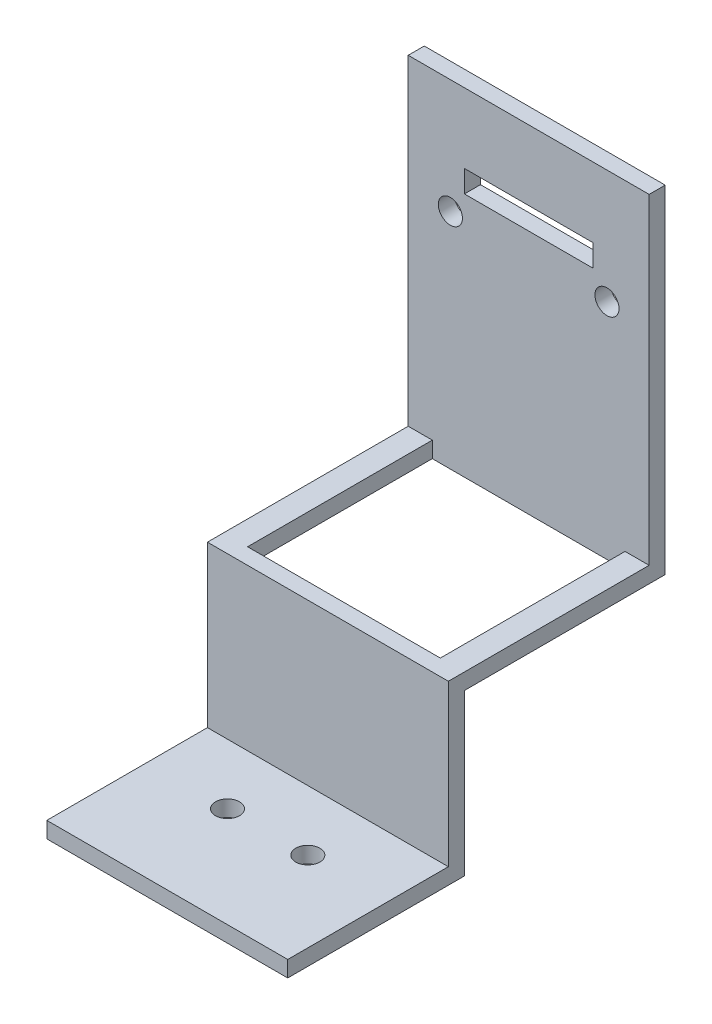
ISO-10303-21;
HEADER;
FILE_DESCRIPTION(('STEP AP214'),'2;1');
FILE_NAME('part.step','',(''),(''),'','','');
FILE_SCHEMA(('AUTOMOTIVE_DESIGN { 1 0 10303 214 1 1 1 1 }'));
ENDSEC;
DATA;
#1=APPLICATION_CONTEXT('core data for automotive mechanical design processes');
#2=APPLICATION_PROTOCOL_DEFINITION('international standard','automotive_design',2000,#1);
#3=PRODUCT_CONTEXT('',#1,'mechanical');
#4=PRODUCT('Part','Part','',(#3));
#5=PRODUCT_RELATED_PRODUCT_CATEGORY('part','',(#4));
#6=PRODUCT_DEFINITION_FORMATION('','',#4);
#7=PRODUCT_DEFINITION_CONTEXT('part definition',#1,'design');
#8=PRODUCT_DEFINITION('design','',#6,#7);
#9=PRODUCT_DEFINITION_SHAPE('','',#8);
#10=(LENGTH_UNIT() NAMED_UNIT(*) SI_UNIT(.MILLI.,.METRE.));
#11=(NAMED_UNIT(*) PLANE_ANGLE_UNIT() SI_UNIT($,.RADIAN.));
#12=(NAMED_UNIT(*) SI_UNIT($,.STERADIAN.) SOLID_ANGLE_UNIT());
#13=UNCERTAINTY_MEASURE_WITH_UNIT(LENGTH_MEASURE(1.E-05),#10,'distance_accuracy_value','');
#14=(GEOMETRIC_REPRESENTATION_CONTEXT(3) GLOBAL_UNCERTAINTY_ASSIGNED_CONTEXT((#13)) GLOBAL_UNIT_ASSIGNED_CONTEXT((#10,
#11,#12)) REPRESENTATION_CONTEXT('',''));
#15=CARTESIAN_POINT('',(0.,0.,0.));
#16=DIRECTION('',(0.,0.,1.));
#17=DIRECTION('',(1.,0.,0.));
#18=AXIS2_PLACEMENT_3D('',#15,#16,#17);
#19=CARTESIAN_POINT('',(0.,0.,2.));
#20=DIRECTION('',(1.,0.,0.));
#21=DIRECTION('',(0.,0.,-1.));
#22=AXIS2_PLACEMENT_3D('',#19,#20,#21);
#23=PLANE('',#22);
#24=DIRECTION('',(0.,-1.,0.));
#25=VECTOR('',#24,1.);
#26=CARTESIAN_POINT('',(0.,0.,0.));
#27=LINE('',#26,#25);
#28=CARTESIAN_POINT('',(0.,40.,0.));
#29=VERTEX_POINT('',#28);
#30=CARTESIAN_POINT('',(0.,-2.,0.));
#31=VERTEX_POINT('',#30);
#32=EDGE_CURVE('E289',#29,#31,#27,.T.);
#33=ORIENTED_EDGE('',*,*,#32,.T.);
#34=DIRECTION('',(0.,0.,-1.));
#35=VECTOR('',#34,1.);
#36=CARTESIAN_POINT('',(0.,-2.,0.));
#37=LINE('',#36,#35);
#38=CARTESIAN_POINT('',(0.,-2.,25.));
#39=VERTEX_POINT('',#38);
#40=EDGE_CURVE('E264',#39,#31,#37,.T.);
#41=ORIENTED_EDGE('',*,*,#40,.F.);
#42=DIRECTION('',(0.,1.,0.));
#43=VECTOR('',#42,1.);
#44=CARTESIAN_POINT('',(0.,-2.,25.));
#45=LINE('',#44,#43);
#46=CARTESIAN_POINT('',(0.,-22.,25.));
#47=VERTEX_POINT('',#46);
#48=EDGE_CURVE('E261',#47,#39,#45,.T.);
#49=ORIENTED_EDGE('',*,*,#48,.F.);
#50=DIRECTION('',(0.,0.,-1.));
#51=VECTOR('',#50,1.);
#52=CARTESIAN_POINT('',(0.,-22.,25.));
#53=LINE('',#52,#51);
#54=CARTESIAN_POINT('',(0.,-22.,47.));
#55=VERTEX_POINT('',#54);
#56=EDGE_CURVE('E259',#55,#47,#53,.T.);
#57=ORIENTED_EDGE('',*,*,#56,.F.);
#58=DIRECTION('',(0.,-1.,0.));
#59=VECTOR('',#58,1.);
#60=CARTESIAN_POINT('',(0.,-20.,47.));
#61=LINE('',#60,#59);
#62=CARTESIAN_POINT('',(0.,-20.,47.));
#63=VERTEX_POINT('',#62);
#64=EDGE_CURVE('E256',#63,#55,#61,.T.);
#65=ORIENTED_EDGE('',*,*,#64,.F.);
#66=DIRECTION('',(0.,0.,1.));
#67=VECTOR('',#66,1.);
#68=CARTESIAN_POINT('',(0.,-20.,27.));
#69=LINE('',#68,#67);
#70=CARTESIAN_POINT('',(0.,-20.,27.));
#71=VERTEX_POINT('',#70);
#72=EDGE_CURVE('E254',#71,#63,#69,.T.);
#73=ORIENTED_EDGE('',*,*,#72,.F.);
#74=DIRECTION('',(0.,-1.,0.));
#75=VECTOR('',#74,1.);
#76=CARTESIAN_POINT('',(0.,-20.,27.));
#77=LINE('',#76,#75);
#78=CARTESIAN_POINT('',(0.,0.,27.));
#79=VERTEX_POINT('',#78);
#80=EDGE_CURVE('E229',#79,#71,#77,.T.);
#81=ORIENTED_EDGE('',*,*,#80,.F.);
#82=DIRECTION('',(0.,0.,1.));
#83=VECTOR('',#82,1.);
#84=CARTESIAN_POINT('',(0.,0.,0.));
#85=LINE('',#84,#83);
#86=CARTESIAN_POINT('',(0.,0.,2.));
#87=VERTEX_POINT('',#86);
#88=EDGE_CURVE('E239',#87,#79,#85,.T.);
#89=ORIENTED_EDGE('',*,*,#88,.F.);
#90=DIRECTION('',(0.,-1.,0.));
#91=VECTOR('',#90,1.);
#92=CARTESIAN_POINT('',(0.,0.,2.));
#93=LINE('',#92,#91);
#94=CARTESIAN_POINT('',(0.,40.,2.));
#95=VERTEX_POINT('',#94);
#96=EDGE_CURVE('E290',#95,#87,#93,.T.);
#97=ORIENTED_EDGE('',*,*,#96,.F.);
#98=DIRECTION('',(0.,0.,-1.));
#99=VECTOR('',#98,1.);
#100=CARTESIAN_POINT('',(0.,40.,2.));
#101=LINE('',#100,#99);
#102=EDGE_CURVE('E42',#95,#29,#101,.T.);
#103=ORIENTED_EDGE('',*,*,#102,.T.);
#104=EDGE_LOOP('',(#33,#41,#49,#57,#65,#73,#81,#89,#97,#103));
#105=FACE_BOUND('',#104,.T.);
#106=ADVANCED_FACE('F35',(#105),#23,.F.);
#107=CARTESIAN_POINT('',(30.,0.,2.));
#108=DIRECTION('',(-1.,0.,0.));
#109=DIRECTION('',(0.,0.,1.));
#110=AXIS2_PLACEMENT_3D('',#107,#108,#109);
#111=PLANE('',#110);
#112=DIRECTION('',(0.,1.,0.));
#113=VECTOR('',#112,1.);
#114=CARTESIAN_POINT('',(30.,0.,0.));
#115=LINE('',#114,#113);
#116=CARTESIAN_POINT('',(30.,-2.,0.));
#117=VERTEX_POINT('',#116);
#118=CARTESIAN_POINT('',(30.,40.,0.));
#119=VERTEX_POINT('',#118);
#120=EDGE_CURVE('E303',#117,#119,#115,.T.);
#121=ORIENTED_EDGE('',*,*,#120,.T.);
#122=DIRECTION('',(0.,0.,-1.));
#123=VECTOR('',#122,1.);
#124=CARTESIAN_POINT('',(30.,40.,2.));
#125=LINE('',#124,#123);
#126=CARTESIAN_POINT('',(30.,40.,2.));
#127=VERTEX_POINT('',#126);
#128=EDGE_CURVE('E11',#127,#119,#125,.T.);
#129=ORIENTED_EDGE('',*,*,#128,.F.);
#130=DIRECTION('',(0.,1.,0.));
#131=VECTOR('',#130,1.);
#132=CARTESIAN_POINT('',(30.,0.,2.));
#133=LINE('',#132,#131);
#134=CARTESIAN_POINT('',(30.,0.,2.));
#135=VERTEX_POINT('',#134);
#136=EDGE_CURVE('E298',#135,#127,#133,.T.);
#137=ORIENTED_EDGE('',*,*,#136,.F.);
#138=DIRECTION('',(0.,0.,1.));
#139=VECTOR('',#138,1.);
#140=CARTESIAN_POINT('',(30.,0.,27.));
#141=LINE('',#140,#139);
#142=CARTESIAN_POINT('',(30.,0.,27.));
#143=VERTEX_POINT('',#142);
#144=EDGE_CURVE('E236',#135,#143,#141,.T.);
#145=ORIENTED_EDGE('',*,*,#144,.T.);
#146=DIRECTION('',(0.,-1.,0.));
#147=VECTOR('',#146,1.);
#148=CARTESIAN_POINT('',(30.,-20.,27.));
#149=LINE('',#148,#147);
#150=CARTESIAN_POINT('',(30.,-20.,27.));
#151=VERTEX_POINT('',#150);
#152=EDGE_CURVE('E238',#143,#151,#149,.T.);
#153=ORIENTED_EDGE('',*,*,#152,.T.);
#154=DIRECTION('',(0.,0.,1.));
#155=VECTOR('',#154,1.);
#156=CARTESIAN_POINT('',(30.,-20.,27.));
#157=LINE('',#156,#155);
#158=CARTESIAN_POINT('',(30.,-20.,47.));
#159=VERTEX_POINT('',#158);
#160=EDGE_CURVE('E241',#151,#159,#157,.T.);
#161=ORIENTED_EDGE('',*,*,#160,.T.);
#162=DIRECTION('',(0.,-1.,0.));
#163=VECTOR('',#162,1.);
#164=CARTESIAN_POINT('',(30.,-20.,47.));
#165=LINE('',#164,#163);
#166=CARTESIAN_POINT('',(30.,-22.,47.));
#167=VERTEX_POINT('',#166);
#168=EDGE_CURVE('E243',#159,#167,#165,.T.);
#169=ORIENTED_EDGE('',*,*,#168,.T.);
#170=DIRECTION('',(0.,0.,-1.));
#171=VECTOR('',#170,1.);
#172=CARTESIAN_POINT('',(30.,-22.,47.));
#173=LINE('',#172,#171);
#174=CARTESIAN_POINT('',(30.,-22.,25.));
#175=VERTEX_POINT('',#174);
#176=EDGE_CURVE('E245',#167,#175,#173,.T.);
#177=ORIENTED_EDGE('',*,*,#176,.T.);
#178=DIRECTION('',(0.,1.,0.));
#179=VECTOR('',#178,1.);
#180=CARTESIAN_POINT('',(30.,-2.,25.));
#181=LINE('',#180,#179);
#182=CARTESIAN_POINT('',(30.,-2.,25.));
#183=VERTEX_POINT('',#182);
#184=EDGE_CURVE('E247',#175,#183,#181,.T.);
#185=ORIENTED_EDGE('',*,*,#184,.T.);
#186=DIRECTION('',(0.,0.,-1.));
#187=VECTOR('',#186,1.);
#188=CARTESIAN_POINT('',(30.,-2.,0.));
#189=LINE('',#188,#187);
#190=EDGE_CURVE('E249',#183,#117,#189,.T.);
#191=ORIENTED_EDGE('',*,*,#190,.T.);
#192=EDGE_LOOP('',(#121,#129,#137,#145,#153,#161,#169,#177,#185,#191));
#193=FACE_BOUND('',#192,.T.);
#194=ADVANCED_FACE('F358',(#193),#111,.F.);
#195=CARTESIAN_POINT('',(0.,40.,2.));
#196=DIRECTION('',(0.,-1.,0.));
#197=DIRECTION('',(0.,0.,-1.));
#198=AXIS2_PLACEMENT_3D('',#195,#196,#197);
#199=PLANE('',#198);
#200=DIRECTION('',(-1.,0.,0.));
#201=VECTOR('',#200,1.);
#202=CARTESIAN_POINT('',(0.,40.,0.));
#203=LINE('',#202,#201);
#204=EDGE_CURVE('E294',#119,#29,#203,.T.);
#205=ORIENTED_EDGE('',*,*,#204,.T.);
#206=ORIENTED_EDGE('',*,*,#102,.F.);
#207=DIRECTION('',(-1.,0.,0.));
#208=VECTOR('',#207,1.);
#209=CARTESIAN_POINT('',(0.,40.,2.));
#210=LINE('',#209,#208);
#211=EDGE_CURVE('E300',#127,#95,#210,.T.);
#212=ORIENTED_EDGE('',*,*,#211,.F.);
#213=ORIENTED_EDGE('',*,*,#128,.T.);
#214=EDGE_LOOP('',(#205,#206,#212,#213));
#215=FACE_BOUND('',#214,.T.);
#216=ADVANCED_FACE('F356',(#215),#199,.F.);
#217=CARTESIAN_POINT('',(0.,0.,2.));
#218=DIRECTION('',(0.,0.,-1.));
#219=DIRECTION('',(-1.,0.,0.));
#220=AXIS2_PLACEMENT_3D('',#217,#218,#219);
#221=PLANE('',#220);
#222=DIRECTION('',(1.,0.,0.));
#223=VECTOR('',#222,1.);
#224=CARTESIAN_POINT('',(0.,31.2975521162836,2.));
#225=LINE('',#224,#223);
#226=CARTESIAN_POINT('',(7.,31.2975521162836,2.));
#227=VERTEX_POINT('',#226);
#228=CARTESIAN_POINT('',(23.,31.2975521162836,2.));
#229=VERTEX_POINT('',#228);
#230=EDGE_CURVE('E203',#227,#229,#225,.T.);
#231=ORIENTED_EDGE('',*,*,#230,.T.);
#232=DIRECTION('',(0.,-1.,0.));
#233=VECTOR('',#232,1.);
#234=CARTESIAN_POINT('',(23.,0.,2.));
#235=LINE('',#234,#233);
#236=CARTESIAN_POINT('',(23.,28.5475521162835,2.));
#237=VERTEX_POINT('',#236);
#238=EDGE_CURVE('E206',#229,#237,#235,.T.);
#239=ORIENTED_EDGE('',*,*,#238,.T.);
#240=DIRECTION('',(-1.,0.,0.));
#241=VECTOR('',#240,1.);
#242=CARTESIAN_POINT('',(0.,28.5475521162835,2.));
#243=LINE('',#242,#241);
#244=CARTESIAN_POINT('',(7.,28.5475521162835,2.));
#245=VERTEX_POINT('',#244);
#246=EDGE_CURVE('E200',#237,#245,#243,.T.);
#247=ORIENTED_EDGE('',*,*,#246,.T.);
#248=DIRECTION('',(0.,1.,0.));
#249=VECTOR('',#248,1.);
#250=CARTESIAN_POINT('',(7.,0.,2.));
#251=LINE('',#250,#249);
#252=EDGE_CURVE('E165',#245,#227,#251,.T.);
#253=ORIENTED_EDGE('',*,*,#252,.T.);
#254=EDGE_LOOP('',(#231,#239,#247,#253));
#255=FACE_BOUND('',#254,.T.);
#256=CARTESIAN_POINT('',(24.75,25.7975521162836,2.));
#257=DIRECTION('',(0.,0.,-1.));
#258=DIRECTION('',(-1.,0.,0.));
#259=AXIS2_PLACEMENT_3D('',#256,#257,#258);
#260=CIRCLE('',#259,1.5);
#261=CARTESIAN_POINT('',(23.25,25.7975521162836,2.));
#262=VERTEX_POINT('',#261);
#263=EDGE_CURVE('E197',#262,#262,#260,.T.);
#264=ORIENTED_EDGE('',*,*,#263,.T.);
#265=EDGE_LOOP('',(#264));
#266=FACE_BOUND('',#265,.T.);
#267=CARTESIAN_POINT('',(5.25,25.7975521162836,2.));
#268=DIRECTION('',(0.,0.,-1.));
#269=DIRECTION('',(-1.,0.,0.));
#270=AXIS2_PLACEMENT_3D('',#267,#268,#269);
#271=CIRCLE('',#270,1.5);
#272=CARTESIAN_POINT('',(3.75,25.7975521162836,2.));
#273=VERTEX_POINT('',#272);
#274=EDGE_CURVE('E185',#273,#273,#271,.T.);
#275=ORIENTED_EDGE('',*,*,#274,.T.);
#276=EDGE_LOOP('',(#275));
#277=FACE_BOUND('',#276,.T.);
#278=ORIENTED_EDGE('',*,*,#96,.T.);
#279=DIRECTION('',(1.,0.,0.));
#280=VECTOR('',#279,1.);
#281=CARTESIAN_POINT('',(0.,0.,2.));
#282=LINE('',#281,#280);
#283=CARTESIAN_POINT('',(3.,0.,2.));
#284=VERTEX_POINT('',#283);
#285=EDGE_CURVE('E295',#87,#284,#282,.T.);
#286=ORIENTED_EDGE('',*,*,#285,.T.);
#287=DIRECTION('',(0.,1.,0.));
#288=VECTOR('',#287,1.);
#289=CARTESIAN_POINT('',(3.,-2.,2.));
#290=LINE('',#289,#288);
#291=CARTESIAN_POINT('',(3.,-2.,2.));
#292=VERTEX_POINT('',#291);
#293=EDGE_CURVE('E232',#292,#284,#290,.T.);
#294=ORIENTED_EDGE('',*,*,#293,.F.);
#295=DIRECTION('',(-1.,0.,0.));
#296=VECTOR('',#295,1.);
#297=CARTESIAN_POINT('',(27.,-2.,2.));
#298=LINE('',#297,#296);
#299=CARTESIAN_POINT('',(27.,-2.,2.));
#300=VERTEX_POINT('',#299);
#301=EDGE_CURVE('E213',#300,#292,#298,.T.);
#302=ORIENTED_EDGE('',*,*,#301,.F.);
#303=DIRECTION('',(0.,1.,0.));
#304=VECTOR('',#303,1.);
#305=CARTESIAN_POINT('',(27.,-2.,2.));
#306=LINE('',#305,#304);
#307=CARTESIAN_POINT('',(27.,0.,2.));
#308=VERTEX_POINT('',#307);
#309=EDGE_CURVE('E220',#300,#308,#306,.T.);
#310=ORIENTED_EDGE('',*,*,#309,.T.);
#311=EDGE_CURVE('E293',#308,#135,#282,.T.);
#312=ORIENTED_EDGE('',*,*,#311,.T.);
#313=ORIENTED_EDGE('',*,*,#136,.T.);
#314=ORIENTED_EDGE('',*,*,#211,.T.);
#315=EDGE_LOOP('',(#278,#286,#294,#302,#310,#312,#313,#314));
#316=FACE_BOUND('',#315,.T.);
#317=ADVANCED_FACE('F353',(#255,#266,#277,#316),#221,.F.);
#318=CARTESIAN_POINT('',(0.,0.,0.));
#319=DIRECTION('',(0.,0.,-1.));
#320=DIRECTION('',(-1.,0.,0.));
#321=AXIS2_PLACEMENT_3D('',#318,#319,#320);
#322=PLANE('',#321);
#323=DIRECTION('',(0.,-1.,0.));
#324=VECTOR('',#323,1.);
#325=CARTESIAN_POINT('',(23.,31.2975521162836,0.));
#326=LINE('',#325,#324);
#327=CARTESIAN_POINT('',(23.,31.2975521162836,0.));
#328=VERTEX_POINT('',#327);
#329=CARTESIAN_POINT('',(23.,28.5475521162835,0.));
#330=VERTEX_POINT('',#329);
#331=EDGE_CURVE('E57',#328,#330,#326,.T.);
#332=ORIENTED_EDGE('',*,*,#331,.F.);
#333=DIRECTION('',(1.,0.,0.));
#334=VECTOR('',#333,1.);
#335=CARTESIAN_POINT('',(23.,31.2975521162836,0.));
#336=LINE('',#335,#334);
#337=CARTESIAN_POINT('',(7.,31.2975521162836,0.));
#338=VERTEX_POINT('',#337);
#339=EDGE_CURVE('E178',#338,#328,#336,.T.);
#340=ORIENTED_EDGE('',*,*,#339,.F.);
#341=DIRECTION('',(0.,1.,0.));
#342=VECTOR('',#341,1.);
#343=CARTESIAN_POINT('',(7.,31.2975521162836,0.));
#344=LINE('',#343,#342);
#345=CARTESIAN_POINT('',(7.,28.5475521162835,0.));
#346=VERTEX_POINT('',#345);
#347=EDGE_CURVE('E162',#346,#338,#344,.T.);
#348=ORIENTED_EDGE('',*,*,#347,.F.);
#349=DIRECTION('',(-1.,0.,0.));
#350=VECTOR('',#349,1.);
#351=CARTESIAN_POINT('',(23.,28.5475521162835,0.));
#352=LINE('',#351,#350);
#353=EDGE_CURVE('E171',#330,#346,#352,.T.);
#354=ORIENTED_EDGE('',*,*,#353,.F.);
#355=EDGE_LOOP('',(#332,#340,#348,#354));
#356=FACE_BOUND('',#355,.T.);
#357=CARTESIAN_POINT('',(24.75,25.7975521162836,0.));
#358=DIRECTION('',(0.,0.,-1.));
#359=DIRECTION('',(-1.,0.,0.));
#360=AXIS2_PLACEMENT_3D('',#357,#358,#359);
#361=CIRCLE('',#360,1.5);
#362=CARTESIAN_POINT('',(23.25,25.7975521162836,0.));
#363=VERTEX_POINT('',#362);
#364=EDGE_CURVE('E188',#363,#363,#361,.T.);
#365=ORIENTED_EDGE('',*,*,#364,.F.);
#366=EDGE_LOOP('',(#365));
#367=FACE_BOUND('',#366,.T.);
#368=CARTESIAN_POINT('',(5.25,25.7975521162836,0.));
#369=DIRECTION('',(0.,0.,-1.));
#370=DIRECTION('',(-1.,0.,0.));
#371=AXIS2_PLACEMENT_3D('',#368,#369,#370);
#372=CIRCLE('',#371,1.5);
#373=CARTESIAN_POINT('',(3.75,25.7975521162836,0.));
#374=VERTEX_POINT('',#373);
#375=EDGE_CURVE('E191',#374,#374,#372,.T.);
#376=ORIENTED_EDGE('',*,*,#375,.F.);
#377=EDGE_LOOP('',(#376));
#378=FACE_BOUND('',#377,.T.);
#379=ORIENTED_EDGE('',*,*,#32,.F.);
#380=ORIENTED_EDGE('',*,*,#204,.F.);
#381=ORIENTED_EDGE('',*,*,#120,.F.);
#382=DIRECTION('',(-1.,0.,0.));
#383=VECTOR('',#382,1.);
#384=CARTESIAN_POINT('',(30.,-2.,0.));
#385=LINE('',#384,#383);
#386=EDGE_CURVE('E252',#117,#31,#385,.T.);
#387=ORIENTED_EDGE('',*,*,#386,.T.);
#388=EDGE_LOOP('',(#379,#380,#381,#387));
#389=FACE_BOUND('',#388,.T.);
#390=ADVANCED_FACE('F175',(#356,#367,#378,#389),#322,.T.);
#391=CARTESIAN_POINT('',(30.,-20.,27.));
#392=DIRECTION('',(0.,0.,-1.));
#393=DIRECTION('',(-1.,0.,0.));
#394=AXIS2_PLACEMENT_3D('',#391,#392,#393);
#395=PLANE('',#394);
#396=ORIENTED_EDGE('',*,*,#80,.T.);
#397=DIRECTION('',(-1.,0.,0.));
#398=VECTOR('',#397,1.);
#399=CARTESIAN_POINT('',(30.,-20.,27.));
#400=LINE('',#399,#398);
#401=EDGE_CURVE('E283',#151,#71,#400,.T.);
#402=ORIENTED_EDGE('',*,*,#401,.F.);
#403=ORIENTED_EDGE('',*,*,#152,.F.);
#404=DIRECTION('',(-1.,0.,0.));
#405=VECTOR('',#404,1.);
#406=CARTESIAN_POINT('',(30.,0.,27.));
#407=LINE('',#406,#405);
#408=EDGE_CURVE('E286',#143,#79,#407,.T.);
#409=ORIENTED_EDGE('',*,*,#408,.T.);
#410=EDGE_LOOP('',(#396,#402,#403,#409));
#411=FACE_BOUND('',#410,.T.);
#412=ADVANCED_FACE('F344',(#411),#395,.F.);
#413=CARTESIAN_POINT('',(30.,-20.,27.));
#414=DIRECTION('',(0.,-1.,0.));
#415=DIRECTION('',(0.,0.,-1.));
#416=AXIS2_PLACEMENT_3D('',#413,#414,#415);
#417=PLANE('',#416);
#418=CARTESIAN_POINT('',(20.,-20.,34.5));
#419=DIRECTION('',(0.,-1.,0.));
#420=DIRECTION('',(0.,0.,-1.));
#421=AXIS2_PLACEMENT_3D('',#418,#419,#420);
#422=CIRCLE('',#421,1.5);
#423=CARTESIAN_POINT('',(20.,-20.,33.));
#424=VERTEX_POINT('',#423);
#425=EDGE_CURVE('E194',#424,#424,#422,.T.);
#426=ORIENTED_EDGE('',*,*,#425,.T.);
#427=EDGE_LOOP('',(#426));
#428=FACE_BOUND('',#427,.T.);
#429=CARTESIAN_POINT('',(10.,-20.,34.5));
#430=DIRECTION('',(0.,-1.,0.));
#431=DIRECTION('',(0.,0.,-1.));
#432=AXIS2_PLACEMENT_3D('',#429,#430,#431);
#433=CIRCLE('',#432,1.5);
#434=CARTESIAN_POINT('',(10.,-20.,33.));
#435=VERTEX_POINT('',#434);
#436=EDGE_CURVE('E531',#435,#435,#433,.T.);
#437=ORIENTED_EDGE('',*,*,#436,.T.);
#438=EDGE_LOOP('',(#437));
#439=FACE_BOUND('',#438,.T.);
#440=ORIENTED_EDGE('',*,*,#72,.T.);
#441=DIRECTION('',(-1.,0.,0.));
#442=VECTOR('',#441,1.);
#443=CARTESIAN_POINT('',(30.,-20.,47.));
#444=LINE('',#443,#442);
#445=EDGE_CURVE('E280',#159,#63,#444,.T.);
#446=ORIENTED_EDGE('',*,*,#445,.F.);
#447=ORIENTED_EDGE('',*,*,#160,.F.);
#448=ORIENTED_EDGE('',*,*,#401,.T.);
#449=EDGE_LOOP('',(#440,#446,#447,#448));
#450=FACE_BOUND('',#449,.T.);
#451=ADVANCED_FACE('F339',(#428,#439,#450),#417,.F.);
#452=CARTESIAN_POINT('',(30.,-20.,47.));
#453=DIRECTION('',(0.,0.,-1.));
#454=DIRECTION('',(0.,1.,0.));
#455=AXIS2_PLACEMENT_3D('',#452,#453,#454);
#456=PLANE('',#455);
#457=ORIENTED_EDGE('',*,*,#64,.T.);
#458=DIRECTION('',(-1.,0.,0.));
#459=VECTOR('',#458,1.);
#460=CARTESIAN_POINT('',(30.,-22.,47.));
#461=LINE('',#460,#459);
#462=EDGE_CURVE('E277',#167,#55,#461,.T.);
#463=ORIENTED_EDGE('',*,*,#462,.F.);
#464=ORIENTED_EDGE('',*,*,#168,.F.);
#465=ORIENTED_EDGE('',*,*,#445,.T.);
#466=EDGE_LOOP('',(#457,#463,#464,#465));
#467=FACE_BOUND('',#466,.T.);
#468=ADVANCED_FACE('F334',(#467),#456,.F.);
#469=CARTESIAN_POINT('',(30.,-22.,25.));
#470=DIRECTION('',(0.,1.,0.));
#471=DIRECTION('',(0.,0.,1.));
#472=AXIS2_PLACEMENT_3D('',#469,#470,#471);
#473=PLANE('',#472);
#474=CARTESIAN_POINT('',(20.,-22.,34.5));
#475=DIRECTION('',(0.,-1.,0.));
#476=DIRECTION('',(0.,0.,-1.));
#477=AXIS2_PLACEMENT_3D('',#474,#475,#476);
#478=CIRCLE('',#477,1.5);
#479=CARTESIAN_POINT('',(20.,-22.,33.));
#480=VERTEX_POINT('',#479);
#481=EDGE_CURVE('E528',#480,#480,#478,.T.);
#482=ORIENTED_EDGE('',*,*,#481,.F.);
#483=EDGE_LOOP('',(#482));
#484=FACE_BOUND('',#483,.T.);
#485=CARTESIAN_POINT('',(10.,-22.,34.5));
#486=DIRECTION('',(0.,-1.,0.));
#487=DIRECTION('',(0.,0.,-1.));
#488=AXIS2_PLACEMENT_3D('',#485,#486,#487);
#489=CIRCLE('',#488,1.5);
#490=CARTESIAN_POINT('',(10.,-22.,33.));
#491=VERTEX_POINT('',#490);
#492=EDGE_CURVE('E536',#491,#491,#489,.T.);
#493=ORIENTED_EDGE('',*,*,#492,.F.);
#494=EDGE_LOOP('',(#493));
#495=FACE_BOUND('',#494,.T.);
#496=ORIENTED_EDGE('',*,*,#56,.T.);
#497=DIRECTION('',(-1.,0.,0.));
#498=VECTOR('',#497,1.);
#499=CARTESIAN_POINT('',(30.,-22.,25.));
#500=LINE('',#499,#498);
#501=EDGE_CURVE('E274',#175,#47,#500,.T.);
#502=ORIENTED_EDGE('',*,*,#501,.F.);
#503=ORIENTED_EDGE('',*,*,#176,.F.);
#504=ORIENTED_EDGE('',*,*,#462,.T.);
#505=EDGE_LOOP('',(#496,#502,#503,#504));
#506=FACE_BOUND('',#505,.T.);
#507=ADVANCED_FACE('F330',(#484,#495,#506),#473,.F.);
#508=CARTESIAN_POINT('',(30.,-2.,25.));
#509=DIRECTION('',(0.,0.,1.));
#510=DIRECTION('',(0.,-1.,0.));
#511=AXIS2_PLACEMENT_3D('',#508,#509,#510);
#512=PLANE('',#511);
#513=ORIENTED_EDGE('',*,*,#48,.T.);
#514=DIRECTION('',(-1.,0.,0.));
#515=VECTOR('',#514,1.);
#516=CARTESIAN_POINT('',(30.,-2.,25.));
#517=LINE('',#516,#515);
#518=CARTESIAN_POINT('',(3.,-2.,25.));
#519=VERTEX_POINT('',#518);
#520=EDGE_CURVE('E270',#519,#39,#517,.T.);
#521=ORIENTED_EDGE('',*,*,#520,.F.);
#522=DIRECTION('',(0.,1.,0.));
#523=VECTOR('',#522,1.);
#524=CARTESIAN_POINT('',(3.,-2.,25.));
#525=LINE('',#524,#523);
#526=CARTESIAN_POINT('',(3.,0.,25.));
#527=VERTEX_POINT('',#526);
#528=EDGE_CURVE('E230',#519,#527,#525,.T.);
#529=ORIENTED_EDGE('',*,*,#528,.T.);
#530=DIRECTION('',(1.,0.,0.));
#531=VECTOR('',#530,1.);
#532=CARTESIAN_POINT('',(27.,0.,25.));
#533=LINE('',#532,#531);
#534=CARTESIAN_POINT('',(27.,0.,25.));
#535=VERTEX_POINT('',#534);
#536=EDGE_CURVE('E214',#527,#535,#533,.T.);
#537=ORIENTED_EDGE('',*,*,#536,.T.);
#538=DIRECTION('',(0.,1.,0.));
#539=VECTOR('',#538,1.);
#540=CARTESIAN_POINT('',(27.,-2.,25.));
#541=LINE('',#540,#539);
#542=CARTESIAN_POINT('',(27.,-2.,25.));
#543=VERTEX_POINT('',#542);
#544=EDGE_CURVE('E227',#543,#535,#541,.T.);
#545=ORIENTED_EDGE('',*,*,#544,.F.);
#546=EDGE_CURVE('E271',#183,#543,#517,.T.);
#547=ORIENTED_EDGE('',*,*,#546,.F.);
#548=ORIENTED_EDGE('',*,*,#184,.F.);
#549=ORIENTED_EDGE('',*,*,#501,.T.);
#550=EDGE_LOOP('',(#513,#521,#529,#537,#545,#547,#548,#549));
#551=FACE_BOUND('',#550,.T.);
#552=ADVANCED_FACE('F324',(#551),#512,.F.);
#553=CARTESIAN_POINT('',(30.,-2.,0.));
#554=DIRECTION('',(0.,1.,0.));
#555=DIRECTION('',(0.,0.,1.));
#556=AXIS2_PLACEMENT_3D('',#553,#554,#555);
#557=PLANE('',#556);
#558=ORIENTED_EDGE('',*,*,#546,.T.);
#559=DIRECTION('',(0.,0.,-1.));
#560=VECTOR('',#559,1.);
#561=CARTESIAN_POINT('',(27.,-2.,2.));
#562=LINE('',#561,#560);
#563=EDGE_CURVE('E210',#543,#300,#562,.T.);
#564=ORIENTED_EDGE('',*,*,#563,.T.);
#565=ORIENTED_EDGE('',*,*,#301,.T.);
#566=DIRECTION('',(0.,0.,1.));
#567=VECTOR('',#566,1.);
#568=CARTESIAN_POINT('',(3.,-2.,2.));
#569=LINE('',#568,#567);
#570=EDGE_CURVE('E217',#292,#519,#569,.T.);
#571=ORIENTED_EDGE('',*,*,#570,.T.);
#572=ORIENTED_EDGE('',*,*,#520,.T.);
#573=ORIENTED_EDGE('',*,*,#40,.T.);
#574=ORIENTED_EDGE('',*,*,#386,.F.);
#575=ORIENTED_EDGE('',*,*,#190,.F.);
#576=EDGE_LOOP('',(#558,#564,#565,#571,#572,#573,#574,#575));
#577=FACE_BOUND('',#576,.T.);
#578=ADVANCED_FACE('F319',(#577),#557,.F.);
#579=CARTESIAN_POINT('',(30.,0.,0.));
#580=DIRECTION('',(0.,-1.,0.));
#581=DIRECTION('',(0.,0.,-1.));
#582=AXIS2_PLACEMENT_3D('',#579,#580,#581);
#583=PLANE('',#582);
#584=ORIENTED_EDGE('',*,*,#311,.F.);
#585=DIRECTION('',(0.,0.,-1.));
#586=VECTOR('',#585,1.);
#587=CARTESIAN_POINT('',(27.,0.,2.));
#588=LINE('',#587,#586);
#589=EDGE_CURVE('E209',#535,#308,#588,.T.);
#590=ORIENTED_EDGE('',*,*,#589,.F.);
#591=ORIENTED_EDGE('',*,*,#536,.F.);
#592=DIRECTION('',(0.,0.,1.));
#593=VECTOR('',#592,1.);
#594=CARTESIAN_POINT('',(3.,0.,2.));
#595=LINE('',#594,#593);
#596=EDGE_CURVE('E222',#284,#527,#595,.T.);
#597=ORIENTED_EDGE('',*,*,#596,.F.);
#598=ORIENTED_EDGE('',*,*,#285,.F.);
#599=ORIENTED_EDGE('',*,*,#88,.T.);
#600=ORIENTED_EDGE('',*,*,#408,.F.);
#601=ORIENTED_EDGE('',*,*,#144,.F.);
#602=EDGE_LOOP('',(#584,#590,#591,#597,#598,#599,#600,#601));
#603=FACE_BOUND('',#602,.T.);
#604=ADVANCED_FACE('F349',(#603),#583,.F.);
#605=CARTESIAN_POINT('',(27.,-2.,2.));
#606=DIRECTION('',(1.,0.,0.));
#607=DIRECTION('',(0.,0.,-1.));
#608=AXIS2_PLACEMENT_3D('',#605,#606,#607);
#609=PLANE('',#608);
#610=ORIENTED_EDGE('',*,*,#589,.T.);
#611=ORIENTED_EDGE('',*,*,#309,.F.);
#612=ORIENTED_EDGE('',*,*,#563,.F.);
#613=ORIENTED_EDGE('',*,*,#544,.T.);
#614=EDGE_LOOP('',(#610,#611,#612,#613));
#615=FACE_BOUND('',#614,.T.);
#616=ADVANCED_FACE('F362',(#615),#609,.F.);
#617=CARTESIAN_POINT('',(3.,-2.,2.));
#618=DIRECTION('',(-1.,0.,0.));
#619=DIRECTION('',(0.,0.,1.));
#620=AXIS2_PLACEMENT_3D('',#617,#618,#619);
#621=PLANE('',#620);
#622=ORIENTED_EDGE('',*,*,#596,.T.);
#623=ORIENTED_EDGE('',*,*,#528,.F.);
#624=ORIENTED_EDGE('',*,*,#570,.F.);
#625=ORIENTED_EDGE('',*,*,#293,.T.);
#626=EDGE_LOOP('',(#622,#623,#624,#625));
#627=FACE_BOUND('',#626,.T.);
#628=ADVANCED_FACE('F365',(#627),#621,.F.);
#629=CARTESIAN_POINT('',(5.25,25.7975521162836,10.));
#630=DIRECTION('',(0.,0.,-1.));
#631=DIRECTION('',(-1.,0.,0.));
#632=AXIS2_PLACEMENT_3D('',#629,#630,#631);
#633=CYLINDRICAL_SURFACE('',#632,1.5);
#634=ORIENTED_EDGE('',*,*,#375,.T.);
#635=EDGE_LOOP('',(#634));
#636=FACE_BOUND('',#635,.T.);
#637=ORIENTED_EDGE('',*,*,#274,.F.);
#638=EDGE_LOOP('',(#637));
#639=FACE_BOUND('',#638,.T.);
#640=ADVANCED_FACE('F368',(#636,#639),#633,.F.);
#641=CARTESIAN_POINT('',(24.75,25.7975521162836,10.));
#642=DIRECTION('',(0.,0.,-1.));
#643=DIRECTION('',(-1.,0.,0.));
#644=AXIS2_PLACEMENT_3D('',#641,#642,#643);
#645=CYLINDRICAL_SURFACE('',#644,1.5);
#646=ORIENTED_EDGE('',*,*,#364,.T.);
#647=EDGE_LOOP('',(#646));
#648=FACE_BOUND('',#647,.T.);
#649=ORIENTED_EDGE('',*,*,#263,.F.);
#650=EDGE_LOOP('',(#649));
#651=FACE_BOUND('',#650,.T.);
#652=ADVANCED_FACE('F374',(#648,#651),#645,.F.);
#653=CARTESIAN_POINT('',(23.,31.2975521162836,10.));
#654=DIRECTION('',(1.,0.,0.));
#655=DIRECTION('',(0.,0.,-1.));
#656=AXIS2_PLACEMENT_3D('',#653,#654,#655);
#657=PLANE('',#656);
#658=DIRECTION('',(0.,0.,-1.));
#659=VECTOR('',#658,1.);
#660=CARTESIAN_POINT('',(23.,31.2975521162836,10.));
#661=LINE('',#660,#659);
#662=EDGE_CURVE('E183',#229,#328,#661,.T.);
#663=ORIENTED_EDGE('',*,*,#662,.T.);
#664=ORIENTED_EDGE('',*,*,#331,.T.);
#665=DIRECTION('',(0.,0.,-1.));
#666=VECTOR('',#665,1.);
#667=CARTESIAN_POINT('',(23.,28.5475521162835,10.));
#668=LINE('',#667,#666);
#669=EDGE_CURVE('E168',#237,#330,#668,.T.);
#670=ORIENTED_EDGE('',*,*,#669,.F.);
#671=ORIENTED_EDGE('',*,*,#238,.F.);
#672=EDGE_LOOP('',(#663,#664,#670,#671));
#673=FACE_BOUND('',#672,.T.);
#674=ADVANCED_FACE('F451',(#673),#657,.F.);
#675=CARTESIAN_POINT('',(23.,31.2975521162836,10.));
#676=DIRECTION('',(0.,1.,0.));
#677=DIRECTION('',(0.,0.,1.));
#678=AXIS2_PLACEMENT_3D('',#675,#676,#677);
#679=PLANE('',#678);
#680=DIRECTION('',(0.,0.,-1.));
#681=VECTOR('',#680,1.);
#682=CARTESIAN_POINT('',(7.,31.2975521162836,10.));
#683=LINE('',#682,#681);
#684=EDGE_CURVE('E167',#227,#338,#683,.T.);
#685=ORIENTED_EDGE('',*,*,#684,.T.);
#686=ORIENTED_EDGE('',*,*,#339,.T.);
#687=ORIENTED_EDGE('',*,*,#662,.F.);
#688=ORIENTED_EDGE('',*,*,#230,.F.);
#689=EDGE_LOOP('',(#685,#686,#687,#688));
#690=FACE_BOUND('',#689,.T.);
#691=ADVANCED_FACE('F461',(#690),#679,.F.);
#692=CARTESIAN_POINT('',(7.,31.2975521162836,10.));
#693=DIRECTION('',(-1.,0.,0.));
#694=DIRECTION('',(0.,0.,1.));
#695=AXIS2_PLACEMENT_3D('',#692,#693,#694);
#696=PLANE('',#695);
#697=DIRECTION('',(0.,0.,-1.));
#698=VECTOR('',#697,1.);
#699=CARTESIAN_POINT('',(7.,28.5475521162835,10.));
#700=LINE('',#699,#698);
#701=EDGE_CURVE('E49',#245,#346,#700,.T.);
#702=ORIENTED_EDGE('',*,*,#701,.T.);
#703=ORIENTED_EDGE('',*,*,#347,.T.);
#704=ORIENTED_EDGE('',*,*,#684,.F.);
#705=ORIENTED_EDGE('',*,*,#252,.F.);
#706=EDGE_LOOP('',(#702,#703,#704,#705));
#707=FACE_BOUND('',#706,.T.);
#708=ADVANCED_FACE('F159',(#707),#696,.F.);
#709=CARTESIAN_POINT('',(23.,28.5475521162835,10.));
#710=DIRECTION('',(0.,-1.,0.));
#711=DIRECTION('',(0.,0.,-1.));
#712=AXIS2_PLACEMENT_3D('',#709,#710,#711);
#713=PLANE('',#712);
#714=ORIENTED_EDGE('',*,*,#669,.T.);
#715=ORIENTED_EDGE('',*,*,#353,.T.);
#716=ORIENTED_EDGE('',*,*,#701,.F.);
#717=ORIENTED_EDGE('',*,*,#246,.F.);
#718=EDGE_LOOP('',(#714,#715,#716,#717));
#719=FACE_BOUND('',#718,.T.);
#720=ADVANCED_FACE('F172',(#719),#713,.F.);
#721=CARTESIAN_POINT('',(10.,-12.,34.5));
#722=DIRECTION('',(0.,-1.,0.));
#723=DIRECTION('',(0.,0.,-1.));
#724=AXIS2_PLACEMENT_3D('',#721,#722,#723);
#725=CYLINDRICAL_SURFACE('',#724,1.5);
#726=ORIENTED_EDGE('',*,*,#492,.T.);
#727=EDGE_LOOP('',(#726));
#728=FACE_BOUND('',#727,.T.);
#729=ORIENTED_EDGE('',*,*,#436,.F.);
#730=EDGE_LOOP('',(#729));
#731=FACE_BOUND('',#730,.T.);
#732=ADVANCED_FACE('F487',(#728,#731),#725,.F.);
#733=CARTESIAN_POINT('',(20.,-12.,34.5));
#734=DIRECTION('',(0.,-1.,0.));
#735=DIRECTION('',(0.,0.,-1.));
#736=AXIS2_PLACEMENT_3D('',#733,#734,#735);
#737=CYLINDRICAL_SURFACE('',#736,1.5);
#738=ORIENTED_EDGE('',*,*,#481,.T.);
#739=EDGE_LOOP('',(#738));
#740=FACE_BOUND('',#739,.T.);
#741=ORIENTED_EDGE('',*,*,#425,.F.);
#742=EDGE_LOOP('',(#741));
#743=FACE_BOUND('',#742,.T.);
#744=ADVANCED_FACE('F511',(#740,#743),#737,.F.);
#745=CLOSED_SHELL('',(#106,#194,#216,#317,#390,#412,#451,#468,#507,#552,#578,#604,#616,#628,
#640,#652,#674,#691,#708,#720,#732,#744));
#746=MANIFOLD_SOLID_BREP('B2',#745);
#747=ADVANCED_BREP_SHAPE_REPRESENTATION('',(#18,#746),#14);
#748=SHAPE_DEFINITION_REPRESENTATION(#9,#747);
ENDSEC;
END-ISO-10303-21;
